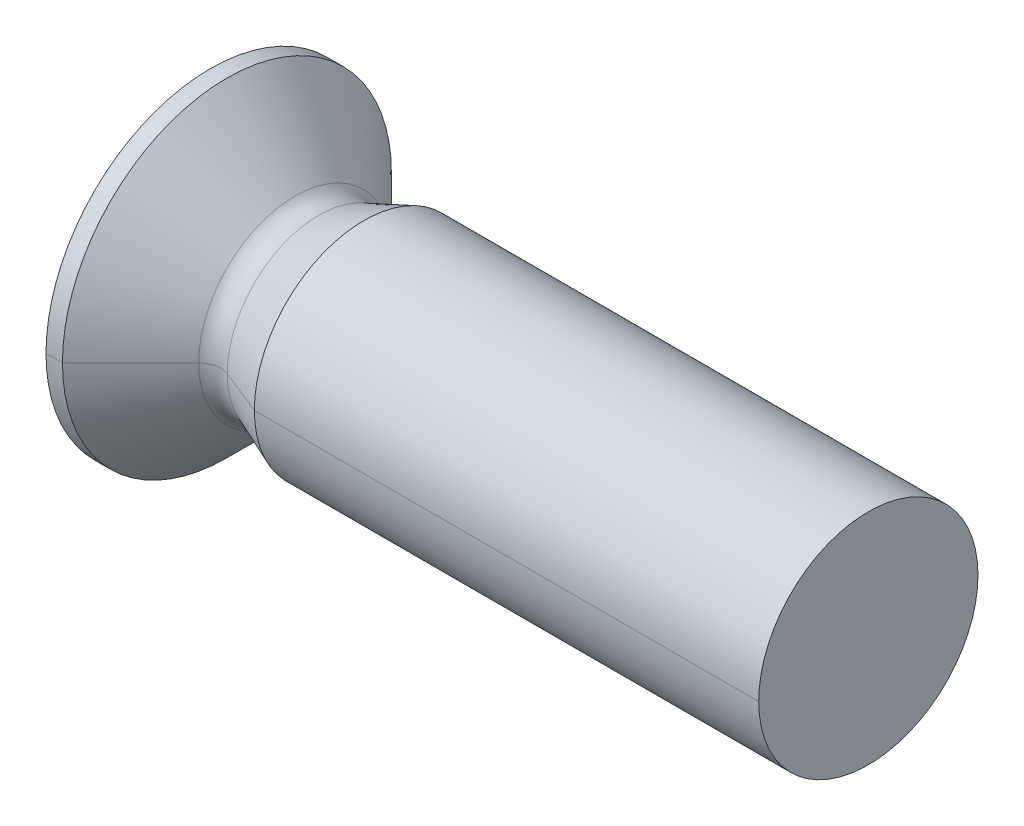
ISO-10303-21;
HEADER;
FILE_DESCRIPTION(('STEP AP214'),'2;1');
FILE_NAME('part.step','',(''),(''),'','','');
FILE_SCHEMA(('AUTOMOTIVE_DESIGN { 1 0 10303 214 1 1 1 1 }'));
ENDSEC;
DATA;
#1=APPLICATION_CONTEXT('core data for automotive mechanical design processes');
#2=APPLICATION_PROTOCOL_DEFINITION('international standard','automotive_design',2000,#1);
#3=PRODUCT_CONTEXT('',#1,'mechanical');
#4=PRODUCT('Part','Part','',(#3));
#5=PRODUCT_RELATED_PRODUCT_CATEGORY('part','',(#4));
#6=PRODUCT_DEFINITION_FORMATION('','',#4);
#7=PRODUCT_DEFINITION_CONTEXT('part definition',#1,'design');
#8=PRODUCT_DEFINITION('design','',#6,#7);
#9=PRODUCT_DEFINITION_SHAPE('','',#8);
#10=(LENGTH_UNIT() NAMED_UNIT(*) SI_UNIT(.MILLI.,.METRE.));
#11=(NAMED_UNIT(*) PLANE_ANGLE_UNIT() SI_UNIT($,.RADIAN.));
#12=(NAMED_UNIT(*) SI_UNIT($,.STERADIAN.) SOLID_ANGLE_UNIT());
#13=UNCERTAINTY_MEASURE_WITH_UNIT(LENGTH_MEASURE(1.E-05),#10,'distance_accuracy_value','');
#14=(GEOMETRIC_REPRESENTATION_CONTEXT(3) GLOBAL_UNCERTAINTY_ASSIGNED_CONTEXT((#13)) GLOBAL_UNIT_ASSIGNED_CONTEXT((#10,
#11,#12)) REPRESENTATION_CONTEXT('',''));
#15=CARTESIAN_POINT('',(0.,0.,0.));
#16=DIRECTION('',(0.,0.,1.));
#17=DIRECTION('',(1.,0.,0.));
#18=AXIS2_PLACEMENT_3D('',#15,#16,#17);
#19=CARTESIAN_POINT('',(-1.4,0.,0.));
#20=DIRECTION('',(1.,0.,0.));
#21=DIRECTION('',(0.,0.,-1.));
#22=AXIS2_PLACEMENT_3D('',#19,#20,#21);
#23=PLANE('',#22);
#24=CARTESIAN_POINT('',(-1.4,0.,0.));
#25=DIRECTION('',(1.,0.,0.));
#26=DIRECTION('',(0.,0.,-1.));
#27=AXIS2_PLACEMENT_3D('',#24,#25,#26);
#28=CIRCLE('',#27,3.);
#29=CARTESIAN_POINT('',(-1.4,0.,-3.));
#30=VERTEX_POINT('',#29);
#31=CARTESIAN_POINT('',(-1.4,0.,3.));
#32=VERTEX_POINT('',#31);
#33=EDGE_CURVE('E11',#30,#32,#28,.T.);
#34=ORIENTED_EDGE('',*,*,#33,.F.);
#35=CARTESIAN_POINT('',(-1.4,0.,0.));
#36=DIRECTION('',(1.,0.,0.));
#37=DIRECTION('',(0.,0.,-1.));
#38=AXIS2_PLACEMENT_3D('',#35,#36,#37);
#39=CIRCLE('',#38,3.);
#40=EDGE_CURVE('E25',#32,#30,#39,.T.);
#41=ORIENTED_EDGE('',*,*,#40,.F.);
#42=EDGE_LOOP('',(#34,#41));
#43=FACE_BOUND('',#42,.T.);
#44=DIRECTION('',(0.,0.,-1.));
#45=VECTOR('',#44,1.);
#46=CARTESIAN_POINT('',(-1.4,-0.4,2.25));
#47=LINE('',#46,#45);
#48=CARTESIAN_POINT('',(-1.4,-0.4,2.25));
#49=VERTEX_POINT('',#48);
#50=CARTESIAN_POINT('',(-1.4,-0.4,1.));
#51=VERTEX_POINT('',#50);
#52=EDGE_CURVE('E523',#49,#51,#47,.T.);
#53=ORIENTED_EDGE('',*,*,#52,.T.);
#54=CARTESIAN_POINT('',(-1.4,-0.999999999999995,0.999999999999995));
#55=DIRECTION('',(1.,0.,0.));
#56=DIRECTION('',(0.,0.,-1.));
#57=AXIS2_PLACEMENT_3D('',#54,#55,#56);
#58=CIRCLE('',#57,0.6);
#59=CARTESIAN_POINT('',(-1.4,-1.,0.4));
#60=VERTEX_POINT('',#59);
#61=EDGE_CURVE('E518',#60,#51,#58,.T.);
#62=ORIENTED_EDGE('',*,*,#61,.F.);
#63=DIRECTION('',(0.,-1.,0.));
#64=VECTOR('',#63,1.);
#65=CARTESIAN_POINT('',(-1.4,-1.,0.4));
#66=LINE('',#65,#64);
#67=CARTESIAN_POINT('',(-1.4,-2.25,0.4));
#68=VERTEX_POINT('',#67);
#69=EDGE_CURVE('E514',#60,#68,#66,.T.);
#70=ORIENTED_EDGE('',*,*,#69,.T.);
#71=DIRECTION('',(0.,0.,-1.));
#72=VECTOR('',#71,1.);
#73=CARTESIAN_POINT('',(-1.4,-2.25,0.4));
#74=LINE('',#73,#72);
#75=CARTESIAN_POINT('',(-1.4,-2.25,-0.4));
#76=VERTEX_POINT('',#75);
#77=EDGE_CURVE('E510',#68,#76,#74,.T.);
#78=ORIENTED_EDGE('',*,*,#77,.T.);
#79=DIRECTION('',(0.,1.,0.));
#80=VECTOR('',#79,1.);
#81=CARTESIAN_POINT('',(-1.4,-2.25,-0.4));
#82=LINE('',#81,#80);
#83=CARTESIAN_POINT('',(-1.4,-1.,-0.4));
#84=VERTEX_POINT('',#83);
#85=EDGE_CURVE('E506',#76,#84,#82,.T.);
#86=ORIENTED_EDGE('',*,*,#85,.T.);
#87=CARTESIAN_POINT('',(-1.4,-0.999999999999995,-0.999999999999995));
#88=DIRECTION('',(1.,0.,0.));
#89=DIRECTION('',(0.,0.,-1.));
#90=AXIS2_PLACEMENT_3D('',#87,#88,#89);
#91=CIRCLE('',#90,0.6);
#92=CARTESIAN_POINT('',(-1.4,-0.4,-1.));
#93=VERTEX_POINT('',#92);
#94=EDGE_CURVE('E501',#93,#84,#91,.T.);
#95=ORIENTED_EDGE('',*,*,#94,.F.);
#96=DIRECTION('',(0.,0.,-1.));
#97=VECTOR('',#96,1.);
#98=CARTESIAN_POINT('',(-1.4,-0.4,-1.));
#99=LINE('',#98,#97);
#100=CARTESIAN_POINT('',(-1.4,-0.4,-2.25));
#101=VERTEX_POINT('',#100);
#102=EDGE_CURVE('E497',#93,#101,#99,.T.);
#103=ORIENTED_EDGE('',*,*,#102,.T.);
#104=DIRECTION('',(0.,1.,0.));
#105=VECTOR('',#104,1.);
#106=CARTESIAN_POINT('',(-1.4,-0.4,-2.25));
#107=LINE('',#106,#105);
#108=CARTESIAN_POINT('',(-1.4,0.4,-2.25));
#109=VERTEX_POINT('',#108);
#110=EDGE_CURVE('E493',#101,#109,#107,.T.);
#111=ORIENTED_EDGE('',*,*,#110,.T.);
#112=DIRECTION('',(0.,0.,1.));
#113=VECTOR('',#112,1.);
#114=CARTESIAN_POINT('',(-1.4,0.4,-2.25));
#115=LINE('',#114,#113);
#116=CARTESIAN_POINT('',(-1.4,0.4,-1.));
#117=VERTEX_POINT('',#116);
#118=EDGE_CURVE('E489',#109,#117,#115,.T.);
#119=ORIENTED_EDGE('',*,*,#118,.T.);
#120=CARTESIAN_POINT('',(-1.4,0.999999999999995,-0.999999999999995));
#121=DIRECTION('',(1.,0.,0.));
#122=DIRECTION('',(0.,0.,-1.));
#123=AXIS2_PLACEMENT_3D('',#120,#121,#122);
#124=CIRCLE('',#123,0.6);
#125=CARTESIAN_POINT('',(-1.4,1.,-0.4));
#126=VERTEX_POINT('',#125);
#127=EDGE_CURVE('E484',#126,#117,#124,.T.);
#128=ORIENTED_EDGE('',*,*,#127,.F.);
#129=DIRECTION('',(0.,1.,0.));
#130=VECTOR('',#129,1.);
#131=CARTESIAN_POINT('',(-1.4,1.,-0.4));
#132=LINE('',#131,#130);
#133=CARTESIAN_POINT('',(-1.4,2.25,-0.4));
#134=VERTEX_POINT('',#133);
#135=EDGE_CURVE('E480',#126,#134,#132,.T.);
#136=ORIENTED_EDGE('',*,*,#135,.T.);
#137=DIRECTION('',(0.,0.,-1.));
#138=VECTOR('',#137,1.);
#139=CARTESIAN_POINT('',(-1.4,2.25,0.));
#140=LINE('',#139,#138);
#141=CARTESIAN_POINT('',(-1.4,2.25,0.4));
#142=VERTEX_POINT('',#141);
#143=EDGE_CURVE('E475',#142,#134,#140,.T.);
#144=ORIENTED_EDGE('',*,*,#143,.F.);
#145=DIRECTION('',(0.,-1.,0.));
#146=VECTOR('',#145,1.);
#147=CARTESIAN_POINT('',(-1.4,2.25,0.4));
#148=LINE('',#147,#146);
#149=CARTESIAN_POINT('',(-1.4,1.,0.4));
#150=VERTEX_POINT('',#149);
#151=EDGE_CURVE('E471',#142,#150,#148,.T.);
#152=ORIENTED_EDGE('',*,*,#151,.T.);
#153=CARTESIAN_POINT('',(-1.4,0.999999999999995,0.999999999999995));
#154=DIRECTION('',(1.,0.,0.));
#155=DIRECTION('',(0.,0.,-1.));
#156=AXIS2_PLACEMENT_3D('',#153,#154,#155);
#157=CIRCLE('',#156,0.6);
#158=CARTESIAN_POINT('',(-1.4,0.4,1.));
#159=VERTEX_POINT('',#158);
#160=EDGE_CURVE('E466',#159,#150,#157,.T.);
#161=ORIENTED_EDGE('',*,*,#160,.F.);
#162=DIRECTION('',(0.,0.,1.));
#163=VECTOR('',#162,1.);
#164=CARTESIAN_POINT('',(-1.4,0.4,1.));
#165=LINE('',#164,#163);
#166=CARTESIAN_POINT('',(-1.4,0.4,2.25));
#167=VERTEX_POINT('',#166);
#168=EDGE_CURVE('E462',#159,#167,#165,.T.);
#169=ORIENTED_EDGE('',*,*,#168,.T.);
#170=DIRECTION('',(0.,-1.,0.));
#171=VECTOR('',#170,1.);
#172=CARTESIAN_POINT('',(-1.4,0.4,2.25));
#173=LINE('',#172,#171);
#174=EDGE_CURVE('E458',#167,#49,#173,.T.);
#175=ORIENTED_EDGE('',*,*,#174,.T.);
#176=EDGE_LOOP('',(#53,#62,#70,#78,#86,#95,#103,#111,#119,#128,#136,#144,#152,#161,#169,#175));
#177=FACE_BOUND('',#176,.T.);
#178=ADVANCED_FACE('F17',(#43,#177),#23,.F.);
#179=CARTESIAN_POINT('',(-0.7,0.4,2.25));
#180=DIRECTION('',(0.,0.,-1.));
#181=DIRECTION('',(-1.,0.,0.));
#182=AXIS2_PLACEMENT_3D('',#179,#180,#181);
#183=PLANE('',#182);
#184=ORIENTED_EDGE('',*,*,#174,.F.);
#185=DIRECTION('',(-1.,0.,0.));
#186=VECTOR('',#185,1.);
#187=CARTESIAN_POINT('',(-0.7,0.4,2.25));
#188=LINE('',#187,#186);
#189=CARTESIAN_POINT('',(-0.7,0.4,2.25));
#190=VERTEX_POINT('',#189);
#191=EDGE_CURVE('E453',#190,#167,#188,.T.);
#192=ORIENTED_EDGE('',*,*,#191,.F.);
#193=DIRECTION('',(0.,-1.,0.));
#194=VECTOR('',#193,1.);
#195=CARTESIAN_POINT('',(-0.7,0.4,2.25));
#196=LINE('',#195,#194);
#197=CARTESIAN_POINT('',(-0.7,-0.4,2.25));
#198=VERTEX_POINT('',#197);
#199=EDGE_CURVE('E449',#190,#198,#196,.T.);
#200=ORIENTED_EDGE('',*,*,#199,.T.);
#201=DIRECTION('',(-1.,0.,0.));
#202=VECTOR('',#201,1.);
#203=CARTESIAN_POINT('',(-0.7,-0.4,2.25));
#204=LINE('',#203,#202);
#205=EDGE_CURVE('E444',#198,#49,#204,.T.);
#206=ORIENTED_EDGE('',*,*,#205,.T.);
#207=EDGE_LOOP('',(#184,#192,#200,#206));
#208=FACE_BOUND('',#207,.T.);
#209=ADVANCED_FACE('F557',(#208),#183,.T.);
#210=CARTESIAN_POINT('',(-0.7,-0.4,2.25));
#211=DIRECTION('',(0.,1.,0.));
#212=DIRECTION('',(0.,0.,1.));
#213=AXIS2_PLACEMENT_3D('',#210,#211,#212);
#214=PLANE('',#213);
#215=ORIENTED_EDGE('',*,*,#52,.F.);
#216=ORIENTED_EDGE('',*,*,#205,.F.);
#217=DIRECTION('',(0.,0.,-1.));
#218=VECTOR('',#217,1.);
#219=CARTESIAN_POINT('',(-0.7,-0.4,2.25));
#220=LINE('',#219,#218);
#221=CARTESIAN_POINT('',(-0.7,-0.4,1.));
#222=VERTEX_POINT('',#221);
#223=EDGE_CURVE('E440',#198,#222,#220,.T.);
#224=ORIENTED_EDGE('',*,*,#223,.T.);
#225=DIRECTION('',(-1.,0.,0.));
#226=VECTOR('',#225,1.);
#227=CARTESIAN_POINT('',(-0.7,-0.4,1.));
#228=LINE('',#227,#226);
#229=EDGE_CURVE('E435',#222,#51,#228,.T.);
#230=ORIENTED_EDGE('',*,*,#229,.T.);
#231=EDGE_LOOP('',(#215,#216,#224,#230));
#232=FACE_BOUND('',#231,.T.);
#233=ADVANCED_FACE('F561',(#232),#214,.T.);
#234=CARTESIAN_POINT('',(-0.7,-0.999999999999995,0.999999999999995));
#235=DIRECTION('',(1.,0.,0.));
#236=DIRECTION('',(0.,-0.707106781186548,0.707106781186547));
#237=AXIS2_PLACEMENT_3D('',#234,#235,#236);
#238=CYLINDRICAL_SURFACE('',#237,0.6);
#239=ORIENTED_EDGE('',*,*,#61,.T.);
#240=ORIENTED_EDGE('',*,*,#229,.F.);
#241=CARTESIAN_POINT('',(-0.7,-0.999999999999995,0.999999999999995));
#242=DIRECTION('',(1.,0.,0.));
#243=DIRECTION('',(0.,0.,-1.));
#244=AXIS2_PLACEMENT_3D('',#241,#242,#243);
#245=CIRCLE('',#244,0.6);
#246=CARTESIAN_POINT('',(-0.7,-1.,0.4));
#247=VERTEX_POINT('',#246);
#248=EDGE_CURVE('E430',#247,#222,#245,.T.);
#249=ORIENTED_EDGE('',*,*,#248,.F.);
#250=DIRECTION('',(-1.,0.,0.));
#251=VECTOR('',#250,1.);
#252=CARTESIAN_POINT('',(-0.7,-1.,0.4));
#253=LINE('',#252,#251);
#254=EDGE_CURVE('E425',#247,#60,#253,.T.);
#255=ORIENTED_EDGE('',*,*,#254,.T.);
#256=EDGE_LOOP('',(#239,#240,#249,#255));
#257=FACE_BOUND('',#256,.T.);
#258=ADVANCED_FACE('F571',(#257),#238,.T.);
#259=CARTESIAN_POINT('',(-0.7,-1.,0.4));
#260=DIRECTION('',(0.,0.,-1.));
#261=DIRECTION('',(-1.,0.,0.));
#262=AXIS2_PLACEMENT_3D('',#259,#260,#261);
#263=PLANE('',#262);
#264=ORIENTED_EDGE('',*,*,#69,.F.);
#265=ORIENTED_EDGE('',*,*,#254,.F.);
#266=DIRECTION('',(0.,-1.,0.));
#267=VECTOR('',#266,1.);
#268=CARTESIAN_POINT('',(-0.7,-1.,0.4));
#269=LINE('',#268,#267);
#270=CARTESIAN_POINT('',(-0.7,-2.25,0.4));
#271=VERTEX_POINT('',#270);
#272=EDGE_CURVE('E421',#247,#271,#269,.T.);
#273=ORIENTED_EDGE('',*,*,#272,.T.);
#274=DIRECTION('',(-1.,0.,0.));
#275=VECTOR('',#274,1.);
#276=CARTESIAN_POINT('',(-0.7,-2.25,0.4));
#277=LINE('',#276,#275);
#278=EDGE_CURVE('E416',#271,#68,#277,.T.);
#279=ORIENTED_EDGE('',*,*,#278,.T.);
#280=EDGE_LOOP('',(#264,#265,#273,#279));
#281=FACE_BOUND('',#280,.T.);
#282=ADVANCED_FACE('F576',(#281),#263,.T.);
#283=CARTESIAN_POINT('',(-0.7,-2.25,0.4));
#284=DIRECTION('',(0.,1.,0.));
#285=DIRECTION('',(0.,0.,1.));
#286=AXIS2_PLACEMENT_3D('',#283,#284,#285);
#287=PLANE('',#286);
#288=ORIENTED_EDGE('',*,*,#77,.F.);
#289=ORIENTED_EDGE('',*,*,#278,.F.);
#290=DIRECTION('',(0.,0.,-1.));
#291=VECTOR('',#290,1.);
#292=CARTESIAN_POINT('',(-0.7,-2.25,0.4));
#293=LINE('',#292,#291);
#294=CARTESIAN_POINT('',(-0.7,-2.25,-0.4));
#295=VERTEX_POINT('',#294);
#296=EDGE_CURVE('E412',#271,#295,#293,.T.);
#297=ORIENTED_EDGE('',*,*,#296,.T.);
#298=DIRECTION('',(-1.,0.,0.));
#299=VECTOR('',#298,1.);
#300=CARTESIAN_POINT('',(-0.7,-2.25,-0.4));
#301=LINE('',#300,#299);
#302=EDGE_CURVE('E407',#295,#76,#301,.T.);
#303=ORIENTED_EDGE('',*,*,#302,.T.);
#304=EDGE_LOOP('',(#288,#289,#297,#303));
#305=FACE_BOUND('',#304,.T.);
#306=ADVANCED_FACE('F582',(#305),#287,.T.);
#307=CARTESIAN_POINT('',(-0.7,-2.25,-0.4));
#308=DIRECTION('',(0.,0.,1.));
#309=DIRECTION('',(1.,0.,0.));
#310=AXIS2_PLACEMENT_3D('',#307,#308,#309);
#311=PLANE('',#310);
#312=ORIENTED_EDGE('',*,*,#85,.F.);
#313=ORIENTED_EDGE('',*,*,#302,.F.);
#314=DIRECTION('',(0.,1.,0.));
#315=VECTOR('',#314,1.);
#316=CARTESIAN_POINT('',(-0.7,-2.25,-0.4));
#317=LINE('',#316,#315);
#318=CARTESIAN_POINT('',(-0.7,-1.,-0.4));
#319=VERTEX_POINT('',#318);
#320=EDGE_CURVE('E403',#295,#319,#317,.T.);
#321=ORIENTED_EDGE('',*,*,#320,.T.);
#322=DIRECTION('',(-1.,0.,0.));
#323=VECTOR('',#322,1.);
#324=CARTESIAN_POINT('',(-0.7,-1.,-0.4));
#325=LINE('',#324,#323);
#326=EDGE_CURVE('E398',#319,#84,#325,.T.);
#327=ORIENTED_EDGE('',*,*,#326,.T.);
#328=EDGE_LOOP('',(#312,#313,#321,#327));
#329=FACE_BOUND('',#328,.T.);
#330=ADVANCED_FACE('F586',(#329),#311,.T.);
#331=CARTESIAN_POINT('',(-0.7,-0.999999999999995,-0.999999999999995));
#332=DIRECTION('',(1.,0.,0.));
#333=DIRECTION('',(0.,-0.707106781186548,-0.707106781186547));
#334=AXIS2_PLACEMENT_3D('',#331,#332,#333);
#335=CYLINDRICAL_SURFACE('',#334,0.6);
#336=ORIENTED_EDGE('',*,*,#94,.T.);
#337=ORIENTED_EDGE('',*,*,#326,.F.);
#338=CARTESIAN_POINT('',(-0.7,-0.999999999999995,-0.999999999999995));
#339=DIRECTION('',(1.,0.,0.));
#340=DIRECTION('',(0.,0.,-1.));
#341=AXIS2_PLACEMENT_3D('',#338,#339,#340);
#342=CIRCLE('',#341,0.6);
#343=CARTESIAN_POINT('',(-0.7,-0.4,-1.));
#344=VERTEX_POINT('',#343);
#345=EDGE_CURVE('E393',#344,#319,#342,.T.);
#346=ORIENTED_EDGE('',*,*,#345,.F.);
#347=DIRECTION('',(-1.,0.,0.));
#348=VECTOR('',#347,1.);
#349=CARTESIAN_POINT('',(-0.7,-0.4,-1.));
#350=LINE('',#349,#348);
#351=EDGE_CURVE('E388',#344,#93,#350,.T.);
#352=ORIENTED_EDGE('',*,*,#351,.T.);
#353=EDGE_LOOP('',(#336,#337,#346,#352));
#354=FACE_BOUND('',#353,.T.);
#355=ADVANCED_FACE('F589',(#354),#335,.T.);
#356=CARTESIAN_POINT('',(-0.7,-0.4,-1.));
#357=DIRECTION('',(0.,1.,0.));
#358=DIRECTION('',(0.,0.,1.));
#359=AXIS2_PLACEMENT_3D('',#356,#357,#358);
#360=PLANE('',#359);
#361=ORIENTED_EDGE('',*,*,#102,.F.);
#362=ORIENTED_EDGE('',*,*,#351,.F.);
#363=DIRECTION('',(0.,0.,-1.));
#364=VECTOR('',#363,1.);
#365=CARTESIAN_POINT('',(-0.7,-0.4,-1.));
#366=LINE('',#365,#364);
#367=CARTESIAN_POINT('',(-0.7,-0.4,-2.25));
#368=VERTEX_POINT('',#367);
#369=EDGE_CURVE('E384',#344,#368,#366,.T.);
#370=ORIENTED_EDGE('',*,*,#369,.T.);
#371=DIRECTION('',(-1.,0.,0.));
#372=VECTOR('',#371,1.);
#373=CARTESIAN_POINT('',(-0.7,-0.4,-2.25));
#374=LINE('',#373,#372);
#375=EDGE_CURVE('E379',#368,#101,#374,.T.);
#376=ORIENTED_EDGE('',*,*,#375,.T.);
#377=EDGE_LOOP('',(#361,#362,#370,#376));
#378=FACE_BOUND('',#377,.T.);
#379=ADVANCED_FACE('F595',(#378),#360,.T.);
#380=CARTESIAN_POINT('',(-0.7,-0.4,-2.25));
#381=DIRECTION('',(0.,0.,1.));
#382=DIRECTION('',(1.,0.,0.));
#383=AXIS2_PLACEMENT_3D('',#380,#381,#382);
#384=PLANE('',#383);
#385=ORIENTED_EDGE('',*,*,#110,.F.);
#386=ORIENTED_EDGE('',*,*,#375,.F.);
#387=DIRECTION('',(0.,1.,0.));
#388=VECTOR('',#387,1.);
#389=CARTESIAN_POINT('',(-0.7,-0.4,-2.25));
#390=LINE('',#389,#388);
#391=CARTESIAN_POINT('',(-0.7,0.4,-2.25));
#392=VERTEX_POINT('',#391);
#393=EDGE_CURVE('E375',#368,#392,#390,.T.);
#394=ORIENTED_EDGE('',*,*,#393,.T.);
#395=DIRECTION('',(-1.,0.,0.));
#396=VECTOR('',#395,1.);
#397=CARTESIAN_POINT('',(-0.7,0.4,-2.25));
#398=LINE('',#397,#396);
#399=EDGE_CURVE('E370',#392,#109,#398,.T.);
#400=ORIENTED_EDGE('',*,*,#399,.T.);
#401=EDGE_LOOP('',(#385,#386,#394,#400));
#402=FACE_BOUND('',#401,.T.);
#403=ADVANCED_FACE('F599',(#402),#384,.T.);
#404=CARTESIAN_POINT('',(-0.7,0.4,-2.25));
#405=DIRECTION('',(0.,-1.,0.));
#406=DIRECTION('',(0.,0.,-1.));
#407=AXIS2_PLACEMENT_3D('',#404,#405,#406);
#408=PLANE('',#407);
#409=ORIENTED_EDGE('',*,*,#118,.F.);
#410=ORIENTED_EDGE('',*,*,#399,.F.);
#411=DIRECTION('',(0.,0.,1.));
#412=VECTOR('',#411,1.);
#413=CARTESIAN_POINT('',(-0.7,0.4,-2.25));
#414=LINE('',#413,#412);
#415=CARTESIAN_POINT('',(-0.7,0.4,-1.));
#416=VERTEX_POINT('',#415);
#417=EDGE_CURVE('E366',#392,#416,#414,.T.);
#418=ORIENTED_EDGE('',*,*,#417,.T.);
#419=DIRECTION('',(-1.,0.,0.));
#420=VECTOR('',#419,1.);
#421=CARTESIAN_POINT('',(-0.7,0.4,-1.));
#422=LINE('',#421,#420);
#423=EDGE_CURVE('E361',#416,#117,#422,.T.);
#424=ORIENTED_EDGE('',*,*,#423,.T.);
#425=EDGE_LOOP('',(#409,#410,#418,#424));
#426=FACE_BOUND('',#425,.T.);
#427=ADVANCED_FACE('F604',(#426),#408,.T.);
#428=CARTESIAN_POINT('',(-0.7,0.999999999999995,-0.999999999999995));
#429=DIRECTION('',(1.,0.,0.));
#430=DIRECTION('',(0.,0.707106781186553,-0.707106781186542));
#431=AXIS2_PLACEMENT_3D('',#428,#429,#430);
#432=CYLINDRICAL_SURFACE('',#431,0.6);
#433=ORIENTED_EDGE('',*,*,#127,.T.);
#434=ORIENTED_EDGE('',*,*,#423,.F.);
#435=CARTESIAN_POINT('',(-0.7,0.999999999999995,-0.999999999999995));
#436=DIRECTION('',(1.,0.,0.));
#437=DIRECTION('',(0.,0.,-1.));
#438=AXIS2_PLACEMENT_3D('',#435,#436,#437);
#439=CIRCLE('',#438,0.6);
#440=CARTESIAN_POINT('',(-0.7,1.,-0.4));
#441=VERTEX_POINT('',#440);
#442=EDGE_CURVE('E356',#441,#416,#439,.T.);
#443=ORIENTED_EDGE('',*,*,#442,.F.);
#444=DIRECTION('',(-1.,0.,0.));
#445=VECTOR('',#444,1.);
#446=CARTESIAN_POINT('',(-0.7,1.,-0.4));
#447=LINE('',#446,#445);
#448=EDGE_CURVE('E351',#441,#126,#447,.T.);
#449=ORIENTED_EDGE('',*,*,#448,.T.);
#450=EDGE_LOOP('',(#433,#434,#443,#449));
#451=FACE_BOUND('',#450,.T.);
#452=ADVANCED_FACE('F609',(#451),#432,.T.);
#453=CARTESIAN_POINT('',(-0.7,1.,-0.4));
#454=DIRECTION('',(0.,0.,1.));
#455=DIRECTION('',(1.,0.,0.));
#456=AXIS2_PLACEMENT_3D('',#453,#454,#455);
#457=PLANE('',#456);
#458=ORIENTED_EDGE('',*,*,#135,.F.);
#459=ORIENTED_EDGE('',*,*,#448,.F.);
#460=DIRECTION('',(0.,1.,0.));
#461=VECTOR('',#460,1.);
#462=CARTESIAN_POINT('',(-0.7,1.,-0.4));
#463=LINE('',#462,#461);
#464=CARTESIAN_POINT('',(-0.7,2.25,-0.4));
#465=VERTEX_POINT('',#464);
#466=EDGE_CURVE('E347',#441,#465,#463,.T.);
#467=ORIENTED_EDGE('',*,*,#466,.T.);
#468=DIRECTION('',(-1.,0.,0.));
#469=VECTOR('',#468,1.);
#470=CARTESIAN_POINT('',(-0.7,2.25,-0.4));
#471=LINE('',#470,#469);
#472=EDGE_CURVE('E342',#465,#134,#471,.T.);
#473=ORIENTED_EDGE('',*,*,#472,.T.);
#474=EDGE_LOOP('',(#458,#459,#467,#473));
#475=FACE_BOUND('',#474,.T.);
#476=ADVANCED_FACE('F612',(#475),#457,.T.);
#477=CARTESIAN_POINT('',(-0.7,2.25,-0.4));
#478=DIRECTION('',(0.,-1.,0.));
#479=DIRECTION('',(0.,0.,-1.));
#480=AXIS2_PLACEMENT_3D('',#477,#478,#479);
#481=PLANE('',#480);
#482=ORIENTED_EDGE('',*,*,#143,.T.);
#483=ORIENTED_EDGE('',*,*,#472,.F.);
#484=DIRECTION('',(0.,0.,1.));
#485=VECTOR('',#484,1.);
#486=CARTESIAN_POINT('',(-0.7,2.25,-0.4));
#487=LINE('',#486,#485);
#488=CARTESIAN_POINT('',(-0.7,2.25,0.4));
#489=VERTEX_POINT('',#488);
#490=EDGE_CURVE('E338',#465,#489,#487,.T.);
#491=ORIENTED_EDGE('',*,*,#490,.T.);
#492=DIRECTION('',(-1.,0.,0.));
#493=VECTOR('',#492,1.);
#494=CARTESIAN_POINT('',(-0.7,2.25,0.4));
#495=LINE('',#494,#493);
#496=EDGE_CURVE('E333',#489,#142,#495,.T.);
#497=ORIENTED_EDGE('',*,*,#496,.T.);
#498=EDGE_LOOP('',(#482,#483,#491,#497));
#499=FACE_BOUND('',#498,.T.);
#500=ADVANCED_FACE('F616',(#499),#481,.T.);
#501=CARTESIAN_POINT('',(-0.7,2.25,0.4));
#502=DIRECTION('',(0.,0.,-1.));
#503=DIRECTION('',(-1.,0.,0.));
#504=AXIS2_PLACEMENT_3D('',#501,#502,#503);
#505=PLANE('',#504);
#506=ORIENTED_EDGE('',*,*,#151,.F.);
#507=ORIENTED_EDGE('',*,*,#496,.F.);
#508=DIRECTION('',(0.,-1.,0.));
#509=VECTOR('',#508,1.);
#510=CARTESIAN_POINT('',(-0.7,2.25,0.4));
#511=LINE('',#510,#509);
#512=CARTESIAN_POINT('',(-0.7,1.,0.4));
#513=VERTEX_POINT('',#512);
#514=EDGE_CURVE('E329',#489,#513,#511,.T.);
#515=ORIENTED_EDGE('',*,*,#514,.T.);
#516=DIRECTION('',(-1.,0.,0.));
#517=VECTOR('',#516,1.);
#518=CARTESIAN_POINT('',(-0.7,1.,0.4));
#519=LINE('',#518,#517);
#520=EDGE_CURVE('E324',#513,#150,#519,.T.);
#521=ORIENTED_EDGE('',*,*,#520,.T.);
#522=EDGE_LOOP('',(#506,#507,#515,#521));
#523=FACE_BOUND('',#522,.T.);
#524=ADVANCED_FACE('F621',(#523),#505,.T.);
#525=CARTESIAN_POINT('',(-0.7,0.999999999999995,0.999999999999995));
#526=DIRECTION('',(1.,0.,0.));
#527=DIRECTION('',(0.,0.707106781186548,0.707106781186547));
#528=AXIS2_PLACEMENT_3D('',#525,#526,#527);
#529=CYLINDRICAL_SURFACE('',#528,0.6);
#530=ORIENTED_EDGE('',*,*,#160,.T.);
#531=ORIENTED_EDGE('',*,*,#520,.F.);
#532=CARTESIAN_POINT('',(-0.7,0.999999999999995,0.999999999999995));
#533=DIRECTION('',(1.,0.,0.));
#534=DIRECTION('',(0.,0.,-1.));
#535=AXIS2_PLACEMENT_3D('',#532,#533,#534);
#536=CIRCLE('',#535,0.6);
#537=CARTESIAN_POINT('',(-0.7,0.4,1.));
#538=VERTEX_POINT('',#537);
#539=EDGE_CURVE('E319',#538,#513,#536,.T.);
#540=ORIENTED_EDGE('',*,*,#539,.F.);
#541=DIRECTION('',(-1.,0.,0.));
#542=VECTOR('',#541,1.);
#543=CARTESIAN_POINT('',(-0.7,0.4,1.));
#544=LINE('',#543,#542);
#545=EDGE_CURVE('E314',#538,#159,#544,.T.);
#546=ORIENTED_EDGE('',*,*,#545,.T.);
#547=EDGE_LOOP('',(#530,#531,#540,#546));
#548=FACE_BOUND('',#547,.T.);
#549=ADVANCED_FACE('F624',(#548),#529,.T.);
#550=CARTESIAN_POINT('',(-0.7,0.4,1.));
#551=DIRECTION('',(0.,-1.,0.));
#552=DIRECTION('',(0.,0.,-1.));
#553=AXIS2_PLACEMENT_3D('',#550,#551,#552);
#554=PLANE('',#553);
#555=ORIENTED_EDGE('',*,*,#168,.F.);
#556=ORIENTED_EDGE('',*,*,#545,.F.);
#557=DIRECTION('',(0.,0.,1.));
#558=VECTOR('',#557,1.);
#559=CARTESIAN_POINT('',(-0.7,0.4,1.));
#560=LINE('',#559,#558);
#561=EDGE_CURVE('E309',#538,#190,#560,.T.);
#562=ORIENTED_EDGE('',*,*,#561,.T.);
#563=ORIENTED_EDGE('',*,*,#191,.T.);
#564=EDGE_LOOP('',(#555,#556,#562,#563));
#565=FACE_BOUND('',#564,.T.);
#566=ADVANCED_FACE('F629',(#565),#554,.T.);
#567=CARTESIAN_POINT('',(-0.7,-0.999999999999995,0.999999999999995));
#568=DIRECTION('',(1.,0.,0.));
#569=DIRECTION('',(0.,0.,-1.));
#570=AXIS2_PLACEMENT_3D('',#567,#568,#569);
#571=PLANE('',#570);
#572=ORIENTED_EDGE('',*,*,#199,.F.);
#573=ORIENTED_EDGE('',*,*,#561,.F.);
#574=ORIENTED_EDGE('',*,*,#539,.T.);
#575=ORIENTED_EDGE('',*,*,#514,.F.);
#576=ORIENTED_EDGE('',*,*,#490,.F.);
#577=ORIENTED_EDGE('',*,*,#466,.F.);
#578=ORIENTED_EDGE('',*,*,#442,.T.);
#579=ORIENTED_EDGE('',*,*,#417,.F.);
#580=ORIENTED_EDGE('',*,*,#393,.F.);
#581=ORIENTED_EDGE('',*,*,#369,.F.);
#582=ORIENTED_EDGE('',*,*,#345,.T.);
#583=ORIENTED_EDGE('',*,*,#320,.F.);
#584=ORIENTED_EDGE('',*,*,#296,.F.);
#585=ORIENTED_EDGE('',*,*,#272,.F.);
#586=ORIENTED_EDGE('',*,*,#248,.T.);
#587=ORIENTED_EDGE('',*,*,#223,.F.);
#588=EDGE_LOOP('',(#572,#573,#574,#575,#576,#577,#578,#579,#580,#581,#582,#583,#584,#585,#586,#587));
#589=FACE_BOUND('',#588,.T.);
#590=ADVANCED_FACE('F632',(#589),#571,.F.);
#591=CARTESIAN_POINT('',(10.6,0.,0.));
#592=DIRECTION('',(-1.,0.,0.));
#593=DIRECTION('',(0.,1.,0.));
#594=AXIS2_PLACEMENT_3D('',#591,#592,#593);
#595=CYLINDRICAL_SURFACE('',#594,3.);
#596=ORIENTED_EDGE('',*,*,#40,.T.);
#597=DIRECTION('',(-1.,0.,0.));
#598=VECTOR('',#597,1.);
#599=CARTESIAN_POINT('',(-1.1,0.,-3.));
#600=LINE('',#599,#598);
#601=CARTESIAN_POINT('',(-1.1,0.,-3.));
#602=VERTEX_POINT('',#601);
#603=EDGE_CURVE('E304',#602,#30,#600,.T.);
#604=ORIENTED_EDGE('',*,*,#603,.F.);
#605=CARTESIAN_POINT('',(-1.1,0.,0.));
#606=DIRECTION('',(1.,0.,0.));
#607=DIRECTION('',(0.,0.,-1.));
#608=AXIS2_PLACEMENT_3D('',#605,#606,#607);
#609=CIRCLE('',#608,3.);
#610=CARTESIAN_POINT('',(-1.1,0.,3.));
#611=VERTEX_POINT('',#610);
#612=EDGE_CURVE('E299',#611,#602,#609,.T.);
#613=ORIENTED_EDGE('',*,*,#612,.F.);
#614=DIRECTION('',(-1.,0.,0.));
#615=VECTOR('',#614,1.);
#616=CARTESIAN_POINT('',(-1.1,0.,3.));
#617=LINE('',#616,#615);
#618=EDGE_CURVE('E295',#611,#32,#617,.T.);
#619=ORIENTED_EDGE('',*,*,#618,.T.);
#620=EDGE_LOOP('',(#596,#604,#613,#619));
#621=FACE_BOUND('',#620,.T.);
#622=ADVANCED_FACE('F532',(#621),#595,.T.);
#623=CARTESIAN_POINT('',(10.6,0.,0.));
#624=DIRECTION('',(-1.,0.,0.));
#625=DIRECTION('',(0.,-1.,0.));
#626=AXIS2_PLACEMENT_3D('',#623,#624,#625);
#627=CYLINDRICAL_SURFACE('',#626,3.);
#628=CARTESIAN_POINT('',(-1.1,0.,0.));
#629=DIRECTION('',(1.,0.,0.));
#630=DIRECTION('',(0.,0.,-1.));
#631=AXIS2_PLACEMENT_3D('',#628,#629,#630);
#632=CIRCLE('',#631,3.);
#633=EDGE_CURVE('E290',#602,#611,#632,.T.);
#634=ORIENTED_EDGE('',*,*,#633,.F.);
#635=ORIENTED_EDGE('',*,*,#603,.T.);
#636=ORIENTED_EDGE('',*,*,#33,.T.);
#637=ORIENTED_EDGE('',*,*,#618,.F.);
#638=EDGE_LOOP('',(#634,#635,#636,#637));
#639=FACE_BOUND('',#638,.T.);
#640=ADVANCED_FACE('F536',(#639),#627,.T.);
#641=CARTESIAN_POINT('',(-1.1,0.,0.));
#642=DIRECTION('',(-1.,0.,0.));
#643=DIRECTION('',(0.,-1.,0.));
#644=AXIS2_PLACEMENT_3D('',#641,#642,#643);
#645=CONICAL_SURFACE('',#644,3.,0.7853981634);
#646=CARTESIAN_POINT('',(0.142782192563589,0.,0.));
#647=DIRECTION('',(1.,0.,0.));
#648=DIRECTION('',(0.,0.,-1.));
#649=AXIS2_PLACEMENT_3D('',#646,#647,#648);
#650=CIRCLE('',#649,1.7572178074);
#651=CARTESIAN_POINT('',(0.142782192563589,0.,-1.7572178074364));
#652=VERTEX_POINT('',#651);
#653=CARTESIAN_POINT('',(0.142782192576267,0.,1.75721780741268));
#654=VERTEX_POINT('',#653);
#655=EDGE_CURVE('E286',#652,#654,#650,.T.);
#656=ORIENTED_EDGE('',*,*,#655,.F.);
#657=DIRECTION('',(-0.707106781184743,0.,-0.707106781188352));
#658=VECTOR('',#657,1.);
#659=CARTESIAN_POINT('',(0.142782192578623,0.,-1.75721780741503));
#660=LINE('',#659,#658);
#661=EDGE_CURVE('E281',#652,#602,#660,.T.);
#662=ORIENTED_EDGE('',*,*,#661,.T.);
#663=ORIENTED_EDGE('',*,*,#633,.T.);
#664=DIRECTION('',(-0.707106781184743,0.,0.707106781188352));
#665=VECTOR('',#664,1.);
#666=CARTESIAN_POINT('',(0.142782192578623,0.,1.75721780741503));
#667=LINE('',#666,#665);
#668=EDGE_CURVE('E276',#654,#611,#667,.T.);
#669=ORIENTED_EDGE('',*,*,#668,.F.);
#670=EDGE_LOOP('',(#656,#662,#663,#669));
#671=FACE_BOUND('',#670,.T.);
#672=ADVANCED_FACE('F539',(#671),#645,.T.);
#673=CARTESIAN_POINT('',(-1.1,0.,0.));
#674=DIRECTION('',(-1.,0.,0.));
#675=DIRECTION('',(0.,1.,0.));
#676=AXIS2_PLACEMENT_3D('',#673,#674,#675);
#677=CONICAL_SURFACE('',#676,3.,0.7853981634);
#678=ORIENTED_EDGE('',*,*,#612,.T.);
#679=ORIENTED_EDGE('',*,*,#661,.F.);
#680=CARTESIAN_POINT('',(0.142782192563589,0.,0.));
#681=DIRECTION('',(1.,0.,0.));
#682=DIRECTION('',(0.,0.,-1.));
#683=AXIS2_PLACEMENT_3D('',#680,#681,#682);
#684=CIRCLE('',#683,1.7572178074);
#685=EDGE_CURVE('E272',#654,#652,#684,.T.);
#686=ORIENTED_EDGE('',*,*,#685,.F.);
#687=ORIENTED_EDGE('',*,*,#668,.T.);
#688=EDGE_LOOP('',(#678,#679,#686,#687));
#689=FACE_BOUND('',#688,.T.);
#690=ADVANCED_FACE('F542',(#689),#677,.T.);
#691=CARTESIAN_POINT('',(0.425624905038184,0.,0.));
#692=DIRECTION('',(1.,0.,0.));
#693=DIRECTION('',(0.,1.,0.));
#694=AXIS2_PLACEMENT_3D('',#691,#692,#693);
#695=TOROIDAL_SURFACE('',#694,2.0400605199,0.4);
#696=CARTESIAN_POINT('',(0.57456973435672,0.,0.));
#697=DIRECTION('',(1.,0.,0.));
#698=DIRECTION('',(0.,0.,-1.));
#699=AXIS2_PLACEMENT_3D('',#696,#697,#698);
#700=CIRCLE('',#699,1.6688255029);
#701=CARTESIAN_POINT('',(0.57456973435672,0.,1.6688255029));
#702=VERTEX_POINT('',#701);
#703=CARTESIAN_POINT('',(0.57456973435672,0.,-1.6688255029484));
#704=VERTEX_POINT('',#703);
#705=EDGE_CURVE('E269',#702,#704,#700,.T.);
#706=ORIENTED_EDGE('',*,*,#705,.F.);
#707=CARTESIAN_POINT('',(0.574569734343819,0.,1.66882550293216));
#708=CARTESIAN_POINT('',(0.570057112574015,0.,1.66701492856982));
#709=CARTESIAN_POINT('',(0.565511449758645,0.,1.66528671398238));
#710=CARTESIAN_POINT('',(0.556360149349123,0.,1.66199712741318));
#711=CARTESIAN_POINT('',(0.551754511754971,0.,1.66043575543141));
#712=CARTESIAN_POINT('',(0.542489369100236,0.,1.65748197712942));
#713=CARTESIAN_POINT('',(0.537829864039654,0.,1.65608957080919));
#714=CARTESIAN_POINT('',(0.528463186761261,0.,1.65347556276552));
#715=CARTESIAN_POINT('',(0.52375601454345,0.,1.65225396104208));
#716=CARTESIAN_POINT('',(0.514300260917602,0.,1.64998318993486));
#717=CARTESIAN_POINT('',(0.509551679509564,0.,1.64893402055107));
#718=CARTESIAN_POINT('',(0.500019422066707,0.,1.64700950831291));
#719=CARTESIAN_POINT('',(0.495235746031888,0.,1.64613416545854));
#720=CARTESIAN_POINT('',(0.485639660153523,0.,1.64455847047359));
#721=CARTESIAN_POINT('',(0.480827250309977,0.,1.64385811834301));
#722=CARTESIAN_POINT('',(0.471180095950017,0.,1.64263333600657));
#723=CARTESIAN_POINT('',(0.466345351433604,0.,1.64210890580071));
#724=CARTESIAN_POINT('',(0.456659956532903,0.,1.64123666467149));
#725=CARTESIAN_POINT('',(0.451809306148615,0.,1.64088885374812));
#726=CARTESIAN_POINT('',(0.442098549475273,0.,1.64037031366713));
#727=CARTESIAN_POINT('',(0.437238443186218,0.,1.6401995845095));
#728=CARTESIAN_POINT('',(0.427515237237944,0.,1.64003543498159));
#729=CARTESIAN_POINT('',(0.422652137578724,0.,1.64004201461132));
#730=CARTESIAN_POINT('',(0.412929411405608,0.,1.64023247390878));
#731=CARTESIAN_POINT('',(0.408069784891712,0.,1.64041635357653));
#732=CARTESIAN_POINT('',(0.398360466906299,0.,1.64096116844337));
#733=CARTESIAN_POINT('',(0.393510775434782,0.,1.64132210364247));
#734=CARTESIAN_POINT('',(0.383827776220496,0.,1.64222054963263));
#735=CARTESIAN_POINT('',(0.378994468477725,0.,1.64275806042369));
#736=CARTESIAN_POINT('',(0.369350663621668,0.,1.64400894286395));
#737=CARTESIAN_POINT('',(0.36454016650838,0.,1.64472231451316));
#738=CARTESIAN_POINT('',(0.354948379480492,0.,1.64632397009183));
#739=CARTESIAN_POINT('',(0.35016708956589,0.,1.64721225402131));
#740=CARTESIAN_POINT('',(0.340640074667453,0.,1.64916255299994));
#741=CARTESIAN_POINT('',(0.335894349683617,0.,1.65022456804909));
#742=CARTESIAN_POINT('',(0.326444775087722,0.,1.65252091709436));
#743=CARTESIAN_POINT('',(0.321740925475663,0.,1.65375525109047));
#744=CARTESIAN_POINT('',(0.31238135638221,0.,1.65639459672263));
#745=CARTESIAN_POINT('',(0.307725636900815,0.,1.65779960835866));
#746=CARTESIAN_POINT('',(0.298468518828423,0.,1.66077844101171));
#747=CARTESIAN_POINT('',(0.293867120237426,0.,1.66235226202873));
#748=CARTESIAN_POINT('',(0.284724762474518,0.,1.66566662071723));
#749=CARTESIAN_POINT('',(0.280183803302607,0.,1.6674071583887));
#750=CARTESIAN_POINT('',(0.271168362539542,0.,1.67105263597457));
#751=CARTESIAN_POINT('',(0.266693880948387,0.,1.67295757588896));
#752=CARTESIAN_POINT('',(0.257817345112861,0.,1.67692932494204));
#753=CARTESIAN_POINT('',(0.25341529086849,0.,1.67899613408074));
#754=CARTESIAN_POINT('',(0.244689463184003,0.,1.68328887332336));
#755=CARTESIAN_POINT('',(0.240365689743888,0.,1.68551480342728));
#756=CARTESIAN_POINT('',(0.231802173038831,0.,1.69012282476102));
#757=CARTESIAN_POINT('',(0.22756242977389,0.,1.69250491599085));
#758=CARTESIAN_POINT('',(0.219172611038364,0.,1.69742209207083));
#759=CARTESIAN_POINT('',(0.21502253556778,0.,1.69995717692099));
#760=CARTESIAN_POINT('',(0.206817570867336,0.,1.70517696936275));
#761=CARTESIAN_POINT('',(0.202762681637476,0.,1.70786167695434));
#762=CARTESIAN_POINT('',(0.194753481072988,0.,1.71337714480663));
#763=CARTESIAN_POINT('',(0.19079916973836,0.,1.71620790506731));
#764=CARTESIAN_POINT('',(0.182996383706751,0.,1.7220117148677));
#765=CARTESIAN_POINT('',(0.179147909009771,0.,1.7249847644074));
#766=CARTESIAN_POINT('',(0.171561911175851,0.,1.73106919685042));
#767=CARTESIAN_POINT('',(0.167824388038911,0.,1.73418057975374));
#768=CARTESIAN_POINT('',(0.160465272238264,0.,1.74053755146223));
#769=CARTESIAN_POINT('',(0.156843679574556,0.,1.74378314026741));
#770=CARTESIAN_POINT('',(0.14972120647043,0.,1.75040417159663));
#771=CARTESIAN_POINT('',(0.146220326030012,0.,1.75377961412068));
#772=CARTESIAN_POINT('',(0.142782192576268,0.,1.75721780741268));
#773=B_SPLINE_CURVE_WITH_KNOTS('',3,(#707,#708,#709,#710,#711,#712,#713,#714,#715,#716,#717,
#718,#719,#720,#721,#722,#723,#724,#725,#726,#727,#728,#729,#730,#731,#732,#733,#734,#735,#736,
#737,#738,#739,#740,#741,#742,#743,#744,#745,#746,#747,#748,#749,#750,#751,#752,#753,#754,#755,
#756,#757,#758,#759,#760,#761,#762,#763,#764,#765,#766,#767,#768,#769,#770,#771,#772),
.UNSPECIFIED.,.F.,.F.,(4,2,2,2,2,2,2,2,2,2,2,2,2,2,2,2,2,2,2,2,2,2,2,2,2,2,2,2,2,2,2,2,4),(0.,
0.014586079070015,0.0291721581400302,0.0437582372100454,0.0583443162800603,0.0729303953500754,
0.0875164744200906,0.102102553490106,0.116688632560121,0.131274711630136,0.145860790700151,
0.160446869770166,0.175032948840182,0.189619027910196,0.204205106980212,0.218791186050227,
0.233377265120242,0.247963344190257,0.262549423260272,0.277135502330287,0.291721581400302,
0.306307660470318,0.320893739540332,0.335479818610348,0.350065897680363,0.364651976750378,
0.379238055820393,0.393824134890408,0.408410213960423,0.422996293030438,0.437582372100454,
0.452168451170468,0.466754530240484),.UNSPECIFIED.);
#774=EDGE_CURVE('E246',#702,#654,#773,.T.);
#775=ORIENTED_EDGE('',*,*,#774,.T.);
#776=ORIENTED_EDGE('',*,*,#685,.T.);
#777=CARTESIAN_POINT('',(0.574569734343819,0.,-1.66882550293216));
#778=CARTESIAN_POINT('',(0.570057112574015,0.,-1.66701492856982));
#779=CARTESIAN_POINT('',(0.565511449758645,0.,-1.66528671398238));
#780=CARTESIAN_POINT('',(0.556360149349122,0.,-1.66199712741318));
#781=CARTESIAN_POINT('',(0.55175451175497,0.,-1.66043575543141));
#782=CARTESIAN_POINT('',(0.542489369100236,0.,-1.65748197712942));
#783=CARTESIAN_POINT('',(0.537829864039653,0.,-1.65608957080919));
#784=CARTESIAN_POINT('',(0.52846318676126,0.,-1.65347556276552));
#785=CARTESIAN_POINT('',(0.52375601454345,0.,-1.65225396104208));
#786=CARTESIAN_POINT('',(0.514300260917602,0.,-1.64998318993486));
#787=CARTESIAN_POINT('',(0.509551679509564,0.,-1.64893402055107));
#788=CARTESIAN_POINT('',(0.500019422066707,0.,-1.64700950831291));
#789=CARTESIAN_POINT('',(0.495235746031887,0.,-1.64613416545854));
#790=CARTESIAN_POINT('',(0.485639660153522,0.,-1.64455847047359));
#791=CARTESIAN_POINT('',(0.480827250309976,0.,-1.64385811834301));
#792=CARTESIAN_POINT('',(0.471180095950017,0.,-1.64263333600657));
#793=CARTESIAN_POINT('',(0.466345351433603,0.,-1.64210890580071));
#794=CARTESIAN_POINT('',(0.456659956532902,0.,-1.64123666467149));
#795=CARTESIAN_POINT('',(0.451809306148615,0.,-1.64088885374812));
#796=CARTESIAN_POINT('',(0.442098549475273,0.,-1.64037031366713));
#797=CARTESIAN_POINT('',(0.437238443186218,0.,-1.6401995845095));
#798=CARTESIAN_POINT('',(0.427515237237943,0.,-1.64003543498159));
#799=CARTESIAN_POINT('',(0.422652137578724,0.,-1.64004201461132));
#800=CARTESIAN_POINT('',(0.412929411405608,0.,-1.64023247390878));
#801=CARTESIAN_POINT('',(0.408069784891711,0.,-1.64041635357653));
#802=CARTESIAN_POINT('',(0.398360466906299,0.,-1.64096116844337));
#803=CARTESIAN_POINT('',(0.393510775434782,0.,-1.64132210364247));
#804=CARTESIAN_POINT('',(0.383827776220495,0.,-1.64222054963263));
#805=CARTESIAN_POINT('',(0.378994468477725,0.,-1.64275806042369));
#806=CARTESIAN_POINT('',(0.369350663621667,0.,-1.64400894286395));
#807=CARTESIAN_POINT('',(0.36454016650838,0.,-1.64472231451316));
#808=CARTESIAN_POINT('',(0.354948379480491,0.,-1.64632397009183));
#809=CARTESIAN_POINT('',(0.35016708956589,0.,-1.64721225402131));
#810=CARTESIAN_POINT('',(0.340640074667452,0.,-1.64916255299994));
#811=CARTESIAN_POINT('',(0.335894349683616,0.,-1.65022456804909));
#812=CARTESIAN_POINT('',(0.326444775087722,0.,-1.65252091709436));
#813=CARTESIAN_POINT('',(0.321740925475663,0.,-1.65375525109047));
#814=CARTESIAN_POINT('',(0.31238135638221,0.,-1.65639459672263));
#815=CARTESIAN_POINT('',(0.307725636900815,0.,-1.65779960835866));
#816=CARTESIAN_POINT('',(0.298468518828423,0.,-1.66077844101171));
#817=CARTESIAN_POINT('',(0.293867120237426,0.,-1.66235226202873));
#818=CARTESIAN_POINT('',(0.284724762474518,0.,-1.66566662071723));
#819=CARTESIAN_POINT('',(0.280183803302607,0.,-1.6674071583887));
#820=CARTESIAN_POINT('',(0.271168362539542,0.,-1.67105263597457));
#821=CARTESIAN_POINT('',(0.266693880948387,0.,-1.67295757588896));
#822=CARTESIAN_POINT('',(0.25781734511286,0.,-1.67692932494204));
#823=CARTESIAN_POINT('',(0.253415290868489,0.,-1.67899613408074));
#824=CARTESIAN_POINT('',(0.244689463184003,0.,-1.68328887332336));
#825=CARTESIAN_POINT('',(0.240365689743888,0.,-1.68551480342728));
#826=CARTESIAN_POINT('',(0.231802173038831,0.,-1.69012282476102));
#827=CARTESIAN_POINT('',(0.22756242977389,0.,-1.69250491599085));
#828=CARTESIAN_POINT('',(0.219172611038364,0.,-1.69742209207083));
#829=CARTESIAN_POINT('',(0.21502253556778,0.,-1.69995717692099));
#830=CARTESIAN_POINT('',(0.206817570867335,0.,-1.70517696936275));
#831=CARTESIAN_POINT('',(0.202762681637475,0.,-1.70786167695434));
#832=CARTESIAN_POINT('',(0.194753481072988,0.,-1.71337714480663));
#833=CARTESIAN_POINT('',(0.19079916973836,0.,-1.71620790506731));
#834=CARTESIAN_POINT('',(0.182996383706751,0.,-1.7220117148677));
#835=CARTESIAN_POINT('',(0.17914790900977,0.,-1.7249847644074));
#836=CARTESIAN_POINT('',(0.17156191117585,0.,-1.73106919685042));
#837=CARTESIAN_POINT('',(0.167824388038911,0.,-1.73418057975374));
#838=CARTESIAN_POINT('',(0.160465272238264,0.,-1.74053755146223));
#839=CARTESIAN_POINT('',(0.156843679574556,0.,-1.74378314026741));
#840=CARTESIAN_POINT('',(0.14972120647043,0.,-1.75040417159663));
#841=CARTESIAN_POINT('',(0.146220326030012,0.,-1.75377961412069));
#842=CARTESIAN_POINT('',(0.142782192576268,0.,-1.75721780741268));
#843=B_SPLINE_CURVE_WITH_KNOTS('',3,(#777,#778,#779,#780,#781,#782,#783,#784,#785,#786,#787,
#788,#789,#790,#791,#792,#793,#794,#795,#796,#797,#798,#799,#800,#801,#802,#803,#804,#805,#806,
#807,#808,#809,#810,#811,#812,#813,#814,#815,#816,#817,#818,#819,#820,#821,#822,#823,#824,#825,
#826,#827,#828,#829,#830,#831,#832,#833,#834,#835,#836,#837,#838,#839,#840,#841,#842),
.UNSPECIFIED.,.F.,.F.,(4,2,2,2,2,2,2,2,2,2,2,2,2,2,2,2,2,2,2,2,2,2,2,2,2,2,2,2,2,2,2,2,4),(0.,
0.0145860790700152,0.0291721581400302,0.0437582372100455,0.0583443162800605,0.0729303953500757,
0.0875164744200907,0.102102553490106,0.116688632560121,0.131274711630136,0.145860790700151,
0.160446869770166,0.175032948840181,0.189619027910197,0.204205106980212,0.218791186050227,
0.233377265120242,0.247963344190257,0.262549423260272,0.277135502330287,0.291721581400303,
0.306307660470318,0.320893739540333,0.335479818610348,0.350065897680363,0.364651976750378,
0.379238055820393,0.393824134890408,0.408410213960424,0.422996293030439,0.437582372100454,
0.452168451170469,0.466754530240484),.UNSPECIFIED.);
#844=EDGE_CURVE('E259',#704,#652,#843,.T.);
#845=ORIENTED_EDGE('',*,*,#844,.F.);
#846=EDGE_LOOP('',(#706,#775,#776,#845));
#847=FACE_BOUND('',#846,.T.);
#848=ADVANCED_FACE('F224',(#847),#695,.F.);
#849=CARTESIAN_POINT('',(0.425624905038184,0.,0.));
#850=DIRECTION('',(1.,0.,0.));
#851=DIRECTION('',(0.,-1.,0.));
#852=AXIS2_PLACEMENT_3D('',#849,#850,#851);
#853=TOROIDAL_SURFACE('',#852,2.0400605199,0.4);
#854=ORIENTED_EDGE('',*,*,#655,.T.);
#855=ORIENTED_EDGE('',*,*,#774,.F.);
#856=CARTESIAN_POINT('',(0.57456973435672,0.,0.));
#857=DIRECTION('',(1.,0.,0.));
#858=DIRECTION('',(0.,0.,-1.));
#859=AXIS2_PLACEMENT_3D('',#856,#857,#858);
#860=CIRCLE('',#859,1.6688255029);
#861=EDGE_CURVE('E204',#704,#702,#860,.T.);
#862=ORIENTED_EDGE('',*,*,#861,.F.);
#863=ORIENTED_EDGE('',*,*,#844,.T.);
#864=EDGE_LOOP('',(#854,#855,#862,#863));
#865=FACE_BOUND('',#864,.T.);
#866=ADVANCED_FACE('F213',(#865),#853,.F.);
#867=CARTESIAN_POINT('',(0.57456973435672,0.,0.));
#868=DIRECTION('',(1.,0.,0.));
#869=DIRECTION('',(0.,-1.,0.));
#870=AXIS2_PLACEMENT_3D('',#867,#868,#869);
#871=CONICAL_SURFACE('',#870,1.6688255029,0.3815528228);
#872=CARTESIAN_POINT('',(1.4,0.,0.));
#873=DIRECTION('',(1.,0.,0.));
#874=DIRECTION('',(0.,0.,-1.));
#875=AXIS2_PLACEMENT_3D('',#872,#873,#874);
#876=CIRCLE('',#875,2.);
#877=CARTESIAN_POINT('',(1.4,0.,-2.));
#878=VERTEX_POINT('',#877);
#879=CARTESIAN_POINT('',(1.4,0.,2.));
#880=VERTEX_POINT('',#879);
#881=EDGE_CURVE('E176',#878,#880,#876,.T.);
#882=ORIENTED_EDGE('',*,*,#881,.F.);
#883=DIRECTION('',(0.928087542420997,0.,-0.372362073260628));
#884=VECTOR('',#883,1.);
#885=CARTESIAN_POINT('',(0.57456973435672,0.,-1.6688255029));
#886=LINE('',#885,#884);
#887=EDGE_CURVE('E196',#704,#878,#886,.T.);
#888=ORIENTED_EDGE('',*,*,#887,.F.);
#889=ORIENTED_EDGE('',*,*,#861,.T.);
#890=DIRECTION('',(0.928087542420997,0.,0.372362073260628));
#891=VECTOR('',#890,1.);
#892=CARTESIAN_POINT('',(0.57456973435672,0.,1.6688255029));
#893=LINE('',#892,#891);
#894=EDGE_CURVE('E192',#702,#880,#893,.T.);
#895=ORIENTED_EDGE('',*,*,#894,.T.);
#896=EDGE_LOOP('',(#882,#888,#889,#895));
#897=FACE_BOUND('',#896,.T.);
#898=ADVANCED_FACE('F223',(#897),#871,.T.);
#899=CARTESIAN_POINT('',(0.57456973435672,0.,0.));
#900=DIRECTION('',(1.,0.,0.));
#901=DIRECTION('',(0.,1.,0.));
#902=AXIS2_PLACEMENT_3D('',#899,#900,#901);
#903=CONICAL_SURFACE('',#902,1.6688255029,0.3815528228);
#904=ORIENTED_EDGE('',*,*,#705,.T.);
#905=ORIENTED_EDGE('',*,*,#887,.T.);
#906=CARTESIAN_POINT('',(1.4,0.,0.));
#907=DIRECTION('',(1.,0.,0.));
#908=DIRECTION('',(0.,0.,-1.));
#909=AXIS2_PLACEMENT_3D('',#906,#907,#908);
#910=CIRCLE('',#909,2.);
#911=EDGE_CURVE('E188',#880,#878,#910,.T.);
#912=ORIENTED_EDGE('',*,*,#911,.F.);
#913=ORIENTED_EDGE('',*,*,#894,.F.);
#914=EDGE_LOOP('',(#904,#905,#912,#913));
#915=FACE_BOUND('',#914,.T.);
#916=ADVANCED_FACE('F548',(#915),#903,.T.);
#917=CARTESIAN_POINT('',(10.6,0.,0.));
#918=DIRECTION('',(-1.,0.,0.));
#919=DIRECTION('',(0.,1.,0.));
#920=AXIS2_PLACEMENT_3D('',#917,#918,#919);
#921=CYLINDRICAL_SURFACE('',#920,2.);
#922=ORIENTED_EDGE('',*,*,#911,.T.);
#923=DIRECTION('',(-1.,0.,0.));
#924=VECTOR('',#923,1.);
#925=CARTESIAN_POINT('',(10.6,0.,-2.));
#926=LINE('',#925,#924);
#927=CARTESIAN_POINT('',(10.6,0.,-2.));
#928=VERTEX_POINT('',#927);
#929=EDGE_CURVE('E168',#928,#878,#926,.T.);
#930=ORIENTED_EDGE('',*,*,#929,.F.);
#931=CARTESIAN_POINT('',(10.6,0.,0.));
#932=DIRECTION('',(1.,0.,0.));
#933=DIRECTION('',(0.,0.,-1.));
#934=AXIS2_PLACEMENT_3D('',#931,#932,#933);
#935=CIRCLE('',#934,2.);
#936=CARTESIAN_POINT('',(10.6,0.,2.));
#937=VERTEX_POINT('',#936);
#938=EDGE_CURVE('E161',#937,#928,#935,.T.);
#939=ORIENTED_EDGE('',*,*,#938,.F.);
#940=DIRECTION('',(-1.,0.,0.));
#941=VECTOR('',#940,1.);
#942=CARTESIAN_POINT('',(10.6,0.,2.));
#943=LINE('',#942,#941);
#944=EDGE_CURVE('E165',#937,#880,#943,.T.);
#945=ORIENTED_EDGE('',*,*,#944,.T.);
#946=EDGE_LOOP('',(#922,#930,#939,#945));
#947=FACE_BOUND('',#946,.T.);
#948=ADVANCED_FACE('F164',(#947),#921,.T.);
#949=CARTESIAN_POINT('',(10.6,0.,0.));
#950=DIRECTION('',(-1.,0.,0.));
#951=DIRECTION('',(0.,-1.,0.));
#952=AXIS2_PLACEMENT_3D('',#949,#950,#951);
#953=CYLINDRICAL_SURFACE('',#952,2.);
#954=CARTESIAN_POINT('',(10.6,0.,0.));
#955=DIRECTION('',(1.,0.,0.));
#956=DIRECTION('',(0.,0.,-1.));
#957=AXIS2_PLACEMENT_3D('',#954,#955,#956);
#958=CIRCLE('',#957,2.);
#959=EDGE_CURVE('E175',#928,#937,#958,.T.);
#960=ORIENTED_EDGE('',*,*,#959,.F.);
#961=ORIENTED_EDGE('',*,*,#929,.T.);
#962=ORIENTED_EDGE('',*,*,#881,.T.);
#963=ORIENTED_EDGE('',*,*,#944,.F.);
#964=EDGE_LOOP('',(#960,#961,#962,#963));
#965=FACE_BOUND('',#964,.T.);
#966=ADVANCED_FACE('F174',(#965),#953,.T.);
#967=CARTESIAN_POINT('',(10.6,2.,0.));
#968=DIRECTION('',(-1.,0.,0.));
#969=DIRECTION('',(0.,0.,1.));
#970=AXIS2_PLACEMENT_3D('',#967,#968,#969);
#971=PLANE('',#970);
#972=ORIENTED_EDGE('',*,*,#959,.T.);
#973=ORIENTED_EDGE('',*,*,#938,.T.);
#974=EDGE_LOOP('',(#972,#973));
#975=FACE_BOUND('',#974,.T.);
#976=ADVANCED_FACE('F178',(#975),#971,.F.);
#977=CLOSED_SHELL('',(#178,#209,#233,#258,#282,#306,#330,#355,#379,#403,#427,#452,#476,#500,
#524,#549,#566,#590,#622,#640,#672,#690,#848,#866,#898,#916,#948,#966,#976));
#978=MANIFOLD_SOLID_BREP('B1',#977);
#979=ADVANCED_BREP_SHAPE_REPRESENTATION('',(#18,#978),#14);
#980=SHAPE_DEFINITION_REPRESENTATION(#9,#979);
ENDSEC;
END-ISO-10303-21;
